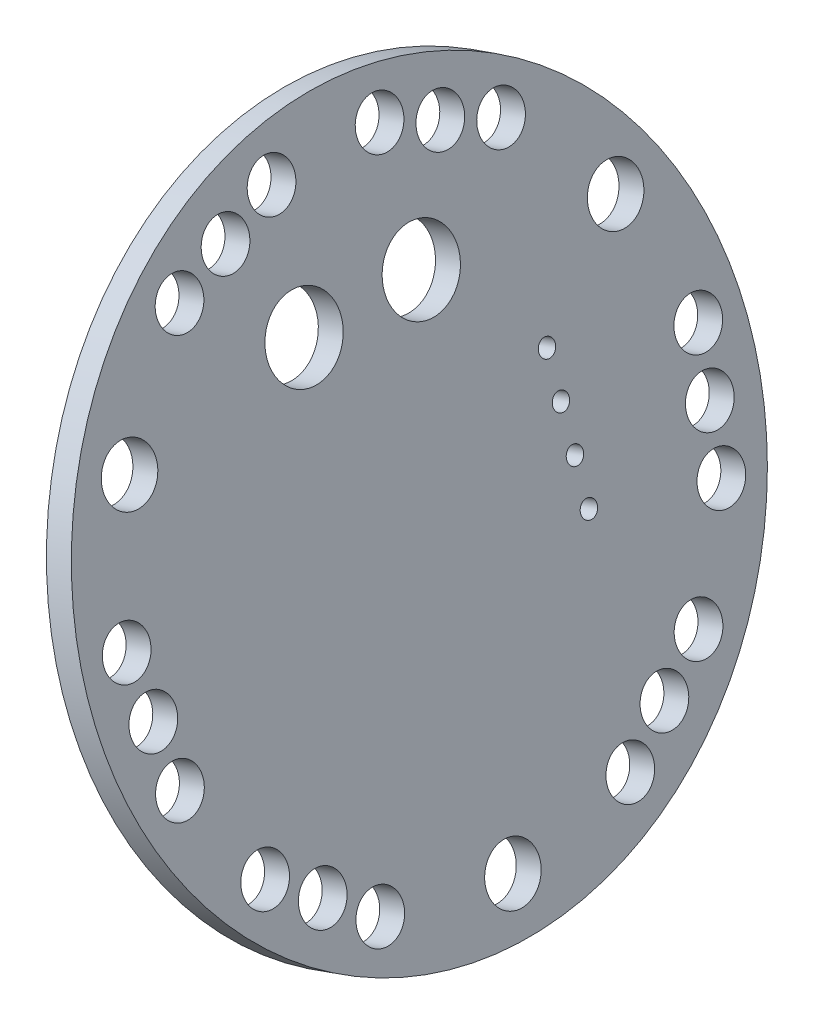
ISO-10303-21;
HEADER;
FILE_DESCRIPTION(('STEP AP214'),'2;1');
FILE_NAME('part.step','',(''),(''),'','','');
FILE_SCHEMA(('AUTOMOTIVE_DESIGN { 1 0 10303 214 1 1 1 1 }'));
ENDSEC;
DATA;
#1=APPLICATION_CONTEXT('core data for automotive mechanical design processes');
#2=APPLICATION_PROTOCOL_DEFINITION('international standard','automotive_design',2000,#1);
#3=PRODUCT_CONTEXT('',#1,'mechanical');
#4=PRODUCT('Part','Part','',(#3));
#5=PRODUCT_RELATED_PRODUCT_CATEGORY('part','',(#4));
#6=PRODUCT_DEFINITION_FORMATION('','',#4);
#7=PRODUCT_DEFINITION_CONTEXT('part definition',#1,'design');
#8=PRODUCT_DEFINITION('design','',#6,#7);
#9=PRODUCT_DEFINITION_SHAPE('','',#8);
#10=(LENGTH_UNIT() NAMED_UNIT(*) SI_UNIT(.MILLI.,.METRE.));
#11=(NAMED_UNIT(*) PLANE_ANGLE_UNIT() SI_UNIT($,.RADIAN.));
#12=(NAMED_UNIT(*) SI_UNIT($,.STERADIAN.) SOLID_ANGLE_UNIT());
#13=UNCERTAINTY_MEASURE_WITH_UNIT(LENGTH_MEASURE(1.E-05),#10,'distance_accuracy_value','');
#14=(GEOMETRIC_REPRESENTATION_CONTEXT(3) GLOBAL_UNCERTAINTY_ASSIGNED_CONTEXT((#13)) GLOBAL_UNIT_ASSIGNED_CONTEXT((#10,
#11,#12)) REPRESENTATION_CONTEXT('',''));
#15=CARTESIAN_POINT('',(0.,0.,0.));
#16=DIRECTION('',(0.,0.,1.));
#17=DIRECTION('',(1.,0.,0.));
#18=AXIS2_PLACEMENT_3D('',#15,#16,#17);
#19=CARTESIAN_POINT('',(-5.18544972870207,-1.83333333333341,0.));
#20=DIRECTION('',(-0.942809041582074,-0.333333333333304,0.));
#21=DIRECTION('',(0.333333333333304,-0.942809041582074,0.));
#22=AXIS2_PLACEMENT_3D('',#19,#20,#21);
#23=CYLINDRICAL_SURFACE('',#22,20.);
#24=CARTESIAN_POINT('',(-5.18544972870207,-1.83333333333341,0.));
#25=DIRECTION('',(0.942809041582074,0.333333333333304,0.));
#26=DIRECTION('',(-0.333333333333304,0.942809041582074,0.));
#27=AXIS2_PLACEMENT_3D('',#24,#25,#26);
#28=CIRCLE('',#27,20.);
#29=CARTESIAN_POINT('',(-11.8521163953682,17.0228474983081,0.));
#30=VERTEX_POINT('',#29);
#31=EDGE_CURVE('E10',#30,#30,#28,.T.);
#32=ORIENTED_EDGE('',*,*,#31,.F.);
#33=EDGE_LOOP('',(#32));
#34=FACE_BOUND('',#33,.T.);
#35=CARTESIAN_POINT('',(-6.69394419523339,-2.36666666666669,0.));
#36=DIRECTION('',(0.942809041582074,0.333333333333304,0.));
#37=DIRECTION('',(-0.333333333333304,0.942809041582074,0.));
#38=AXIS2_PLACEMENT_3D('',#35,#36,#37);
#39=CIRCLE('',#38,20.);
#40=CARTESIAN_POINT('',(-13.3606108618995,16.4895141649748,0.));
#41=VERTEX_POINT('',#40);
#42=EDGE_CURVE('E40',#41,#41,#39,.T.);
#43=ORIENTED_EDGE('',*,*,#42,.T.);
#44=EDGE_LOOP('',(#43));
#45=FACE_BOUND('',#44,.T.);
#46=ADVANCED_FACE('F33',(#34,#45),#23,.T.);
#47=CARTESIAN_POINT('',(-5.18544972870207,-1.83333333333341,0.));
#48=DIRECTION('',(0.942809041582074,0.333333333333304,0.));
#49=DIRECTION('',(-0.333333333333304,0.942809041582074,0.));
#50=AXIS2_PLACEMENT_3D('',#47,#48,#49);
#51=PLANE('',#50);
#52=CARTESIAN_POINT('',(-8.51878306203511,7.59475708248732,3.64999999999999));
#53=DIRECTION('',(0.942809041582074,0.333333333333304,0.));
#54=DIRECTION('',(-0.333333333333304,0.942809041582074,0.));
#55=AXIS2_PLACEMENT_3D('',#52,#53,#54);
#56=CIRCLE('',#55,2.25);
#57=CARTESIAN_POINT('',(-9.26878306203505,9.71607742604698,3.64999999999999));
#58=VERTEX_POINT('',#57);
#59=EDGE_CURVE('E132',#58,#58,#56,.T.);
#60=ORIENTED_EDGE('',*,*,#59,.F.);
#61=EDGE_LOOP('',(#60));
#62=FACE_BOUND('',#61,.T.);
#63=CARTESIAN_POINT('',(-8.5187830620351,7.59475708248732,-3.45));
#64=DIRECTION('',(0.942809041582074,0.333333333333304,0.));
#65=DIRECTION('',(-0.333333333333304,0.942809041582074,0.));
#66=AXIS2_PLACEMENT_3D('',#63,#64,#65);
#67=CIRCLE('',#66,2.25);
#68=CARTESIAN_POINT('',(-9.26878306203504,9.71607742604699,-3.45));
#69=VERTEX_POINT('',#68);
#70=EDGE_CURVE('E138',#69,#69,#67,.T.);
#71=ORIENTED_EDGE('',*,*,#70,.F.);
#72=EDGE_LOOP('',(#71));
#73=FACE_BOUND('',#72,.T.);
#74=CARTESIAN_POINT('',(-5.60878306203536,-0.635965850524169,-9.00000000000003));
#75=DIRECTION('',(0.942809041582074,0.333333333333304,0.));
#76=DIRECTION('',(-0.333333333333304,0.942809041582074,0.));
#77=AXIS2_PLACEMENT_3D('',#74,#75,#76);
#78=CIRCLE('',#77,0.500000000000001);
#79=CARTESIAN_POINT('',(-5.77544972870201,-0.164561329733131,-9.00000000000003));
#80=VERTEX_POINT('',#79);
#81=EDGE_CURVE('E147',#80,#80,#78,.T.);
#82=ORIENTED_EDGE('',*,*,#81,.F.);
#83=EDGE_LOOP('',(#82));
#84=FACE_BOUND('',#83,.T.);
#85=CARTESIAN_POINT('',(-3.91544972870217,-5.42543578176111,-9.00000000000009));
#86=DIRECTION('',(0.942809041582074,0.333333333333304,0.));
#87=DIRECTION('',(-0.333333333333304,0.942809041582074,0.));
#88=AXIS2_PLACEMENT_3D('',#85,#86,#87);
#89=CIRCLE('',#88,0.500000000000001);
#90=CARTESIAN_POINT('',(-4.08211639536883,-4.95403126097007,-9.00000000000009));
#91=VERTEX_POINT('',#90);
#92=EDGE_CURVE('E150',#91,#91,#89,.T.);
#93=ORIENTED_EDGE('',*,*,#92,.F.);
#94=EDGE_LOOP('',(#93));
#95=FACE_BOUND('',#94,.T.);
#96=CARTESIAN_POINT('',(-4.76211639536877,-3.03070081614264,-9.00000000000006));
#97=DIRECTION('',(0.942809041582074,0.333333333333304,0.));
#98=DIRECTION('',(-0.333333333333304,0.942809041582074,0.));
#99=AXIS2_PLACEMENT_3D('',#96,#97,#98);
#100=CIRCLE('',#99,0.500000000000001);
#101=CARTESIAN_POINT('',(-4.92878306203542,-2.5592962953516,-9.00000000000006));
#102=VERTEX_POINT('',#101);
#103=EDGE_CURVE('E136',#102,#102,#100,.T.);
#104=ORIENTED_EDGE('',*,*,#103,.F.);
#105=EDGE_LOOP('',(#104));
#106=FACE_BOUND('',#105,.T.);
#107=CARTESIAN_POINT('',(-6.45544972870195,1.7587691150943,-9.00000000000001));
#108=DIRECTION('',(0.942809041582074,0.333333333333304,0.));
#109=DIRECTION('',(-0.333333333333304,0.942809041582074,0.));
#110=AXIS2_PLACEMENT_3D('',#107,#108,#109);
#111=CIRCLE('',#110,0.500000000000001);
#112=CARTESIAN_POINT('',(-6.6221163953686,2.23017363588534,-9.00000000000001));
#113=VERTEX_POINT('',#112);
#114=EDGE_CURVE('E121',#113,#113,#111,.T.);
#115=ORIENTED_EDGE('',*,*,#114,.F.);
#116=EDGE_LOOP('',(#115));
#117=FACE_BOUND('',#116,.T.);
#118=CARTESIAN_POINT('',(-4.44580130612193,-3.92537499453511,16.8545626433548));
#119=DIRECTION('',(0.942809041582074,0.333333333333304,0.));
#120=DIRECTION('',(-0.166666666666648,0.47140452079103,-0.866025403784443));
#121=AXIS2_PLACEMENT_3D('',#118,#119,#120);
#122=CIRCLE('',#121,1.4);
#123=CARTESIAN_POINT('',(-4.67913463945523,-3.26540866542767,15.6421270780566));
#124=VERTEX_POINT('',#123);
#125=EDGE_CURVE('E182',#124,#124,#122,.T.);
#126=ORIENTED_EDGE('',*,*,#125,.F.);
#127=EDGE_LOOP('',(#126));
#128=FACE_BOUND('',#127,.T.);
#129=CARTESIAN_POINT('',(-5.60248697772461,-0.653773866168512,17.3114043161249));
#130=DIRECTION('',(0.942809041582074,0.333333333333304,0.));
#131=DIRECTION('',(-0.166666666666648,0.47140452079103,-0.866025403784443));
#132=AXIS2_PLACEMENT_3D('',#129,#130,#131);
#133=CIRCLE('',#132,1.4);
#134=CARTESIAN_POINT('',(-5.83582031105791,0.00619246293893092,16.0989687508267));
#135=VERTEX_POINT('',#134);
#136=EDGE_CURVE('E159',#135,#135,#133,.T.);
#137=ORIENTED_EDGE('',*,*,#136,.F.);
#138=EDGE_LOOP('',(#137));
#139=FACE_BOUND('',#138,.T.);
#140=CARTESIAN_POINT('',(-3.28911563451925,-7.19697612290172,16.3977209705846));
#141=DIRECTION('',(0.942809041582074,0.333333333333304,0.));
#142=DIRECTION('',(-0.166666666666648,0.47140452079103,-0.866025403784443));
#143=AXIS2_PLACEMENT_3D('',#140,#141,#142);
#144=CIRCLE('',#143,1.4);
#145=CARTESIAN_POINT('',(-3.52244896785255,-6.53700979379428,15.1852854052864));
#146=VERTEX_POINT('',#145);
#147=EDGE_CURVE('E129',#146,#146,#144,.T.);
#148=ORIENTED_EDGE('',*,*,#147,.F.);
#149=EDGE_LOOP('',(#148));
#150=FACE_BOUND('',#149,.T.);
#151=CARTESIAN_POINT('',(-4.4458013061218,-3.92537499453532,-16.8545626433548));
#152=DIRECTION('',(0.942809041582074,0.333333333333304,0.));
#153=DIRECTION('',(0.166666666666655,-0.47140452079104,-0.866025403784436));
#154=AXIS2_PLACEMENT_3D('',#151,#152,#153);
#155=CIRCLE('',#154,1.4);
#156=CARTESIAN_POINT('',(-4.21246797278848,-4.58534132364277,-18.066998208653));
#157=VERTEX_POINT('',#156);
#158=EDGE_CURVE('E169',#157,#157,#155,.T.);
#159=ORIENTED_EDGE('',*,*,#158,.F.);
#160=EDGE_LOOP('',(#159));
#161=FACE_BOUND('',#160,.T.);
#162=CARTESIAN_POINT('',(-3.28911563451912,-7.19697612290191,-16.3977209705846));
#163=DIRECTION('',(0.942809041582074,0.333333333333304,0.));
#164=DIRECTION('',(0.166666666666655,-0.47140452079104,-0.866025403784436));
#165=AXIS2_PLACEMENT_3D('',#162,#163,#164);
#166=CIRCLE('',#165,1.4);
#167=CARTESIAN_POINT('',(-3.05578230118581,-7.85694245200937,-17.6101565358828));
#168=VERTEX_POINT('',#167);
#169=EDGE_CURVE('E172',#168,#168,#166,.T.);
#170=ORIENTED_EDGE('',*,*,#169,.F.);
#171=EDGE_LOOP('',(#170));
#172=FACE_BOUND('',#171,.T.);
#173=CARTESIAN_POINT('',(-0.689780800385431,-14.549005274064,-10.3489442931482));
#174=DIRECTION('',(0.942809041582074,0.333333333333304,0.));
#175=DIRECTION('',(-0.166666666666655,0.47140452079104,0.866025403784436));
#176=AXIS2_PLACEMENT_3D('',#173,#174,#175);
#177=CIRCLE('',#176,1.4);
#178=CARTESIAN_POINT('',(-0.923114133718747,-13.8890389449566,-9.13650872784998));
#179=VERTEX_POINT('',#178);
#180=EDGE_CURVE('E166',#179,#179,#177,.T.);
#181=ORIENTED_EDGE('',*,*,#180,.F.);
#182=EDGE_LOOP('',(#181));
#183=FACE_BOUND('',#182,.T.);
#184=CARTESIAN_POINT('',(0.0204408667913367,-16.5578155020895,-7.57220760212885));
#185=DIRECTION('',(0.942809041582074,0.333333333333304,0.));
#186=DIRECTION('',(-0.166666666666655,0.47140452079104,0.866025403784436));
#187=AXIS2_PLACEMENT_3D('',#184,#185,#186);
#188=CIRCLE('',#187,1.4);
#189=CARTESIAN_POINT('',(-0.21289246654198,-15.897849172982,-6.35977203683064));
#190=VERTEX_POINT('',#189);
#191=EDGE_CURVE('E173',#190,#190,#188,.T.);
#192=ORIENTED_EDGE('',*,*,#191,.F.);
#193=EDGE_LOOP('',(#192));
#194=FACE_BOUND('',#193,.T.);
#195=CARTESIAN_POINT('',(-1.4000024675623,-12.5401950460384,13.1256809841677));
#196=DIRECTION('',(0.942809041582074,0.333333333333304,0.));
#197=DIRECTION('',(0.166666666666648,-0.47140452079103,0.866025403784443));
#198=AXIS2_PLACEMENT_3D('',#195,#196,#197);
#199=CIRCLE('',#198,1.4);
#200=CARTESIAN_POINT('',(-1.166669134229,-13.2001613751459,14.3381165494659));
#201=VERTEX_POINT('',#200);
#202=EDGE_CURVE('E158',#201,#201,#199,.T.);
#203=ORIENTED_EDGE('',*,*,#202,.F.);
#204=EDGE_LOOP('',(#203));
#205=FACE_BOUND('',#204,.T.);
#206=CARTESIAN_POINT('',(-0.689780800385511,-14.5490052740639,10.3489442931484));
#207=DIRECTION('',(0.942809041582074,0.333333333333304,0.));
#208=DIRECTION('',(0.166666666666648,-0.47140452079103,0.866025403784443));
#209=AXIS2_PLACEMENT_3D('',#206,#207,#208);
#210=CIRCLE('',#209,1.4);
#211=CARTESIAN_POINT('',(-0.456447467052204,-15.2089716031713,11.5613798584466));
#212=VERTEX_POINT('',#211);
#213=EDGE_CURVE('E155',#212,#212,#210,.T.);
#214=ORIENTED_EDGE('',*,*,#213,.F.);
#215=EDGE_LOOP('',(#214));
#216=FACE_BOUND('',#215,.T.);
#217=CARTESIAN_POINT('',(0.0204408667912807,-16.5578155020894,7.57220760212905));
#218=DIRECTION('',(0.942809041582074,0.333333333333304,0.));
#219=DIRECTION('',(0.166666666666648,-0.47140452079103,0.866025403784443));
#220=AXIS2_PLACEMENT_3D('',#217,#218,#219);
#221=CIRCLE('',#220,1.4);
#222=CARTESIAN_POINT('',(0.253774200124588,-17.2177818311968,8.78464316742728));
#223=VERTEX_POINT('',#222);
#224=EDGE_CURVE('E162',#223,#223,#221,.T.);
#225=ORIENTED_EDGE('',*,*,#224,.F.);
#226=EDGE_LOOP('',(#225));
#227=FACE_BOUND('',#226,.T.);
#228=CARTESIAN_POINT('',(-1.4000024675622,-12.5401950460386,-13.1256809841675));
#229=DIRECTION('',(0.942809041582074,0.333333333333304,0.));
#230=DIRECTION('',(-0.166666666666655,0.47140452079104,0.866025403784436));
#231=AXIS2_PLACEMENT_3D('',#228,#229,#230);
#232=CIRCLE('',#231,1.4);
#233=CARTESIAN_POINT('',(-1.63333580089552,-11.8802287169311,-11.9132454188693));
#234=VERTEX_POINT('',#233);
#235=EDGE_CURVE('E163',#234,#234,#232,.T.);
#236=ORIENTED_EDGE('',*,*,#235,.F.);
#237=EDGE_LOOP('',(#236));
#238=FACE_BOUND('',#237,.T.);
#239=CARTESIAN_POINT('',(-5.60248697772447,-0.653773866168718,-17.311404316125));
#240=DIRECTION('',(0.942809041582074,0.333333333333304,0.));
#241=DIRECTION('',(0.166666666666655,-0.47140452079104,-0.866025403784436));
#242=AXIS2_PLACEMENT_3D('',#239,#240,#241);
#243=CIRCLE('',#242,1.4);
#244=CARTESIAN_POINT('',(-5.36915364439116,-1.31374019527618,-18.5238398814232));
#245=VERTEX_POINT('',#244);
#246=EDGE_CURVE('E83',#245,#245,#243,.T.);
#247=ORIENTED_EDGE('',*,*,#246,.F.);
#248=EDGE_LOOP('',(#247));
#249=FACE_BOUND('',#248,.T.);
#250=CARTESIAN_POINT('',(-9.97430307517302,11.7115893682579,9.73919671399603));
#251=DIRECTION('',(0.942809041582074,0.333333333333304,0.));
#252=DIRECTION('',(-0.333333333333304,0.942809041582074,0.));
#253=AXIS2_PLACEMENT_3D('',#250,#251,#252);
#254=CIRCLE('',#253,1.4);
#255=CARTESIAN_POINT('',(-10.4409697418396,13.0315220264728,9.73919671399603));
#256=VERTEX_POINT('',#255);
#257=EDGE_CURVE('E64',#256,#256,#254,.T.);
#258=ORIENTED_EDGE('',*,*,#257,.F.);
#259=EDGE_LOOP('',(#258));
#260=FACE_BOUND('',#259,.T.);
#261=CARTESIAN_POINT('',(-10.8672310840248,14.2371711689402,-3.27203998641704));
#262=DIRECTION('',(0.942809041582074,0.333333333333304,0.));
#263=DIRECTION('',(0.333333333333304,-0.942809041582074,0.));
#264=AXIS2_PLACEMENT_3D('',#261,#262,#263);
#265=CIRCLE('',#264,1.4);
#266=CARTESIAN_POINT('',(-10.4005644173582,12.9172385107253,-3.27203998641704));
#267=VERTEX_POINT('',#266);
#268=EDGE_CURVE('E116',#267,#267,#265,.T.);
#269=ORIENTED_EDGE('',*,*,#268,.F.);
#270=EDGE_LOOP('',(#269));
#271=FACE_BOUND('',#270,.T.);
#272=CARTESIAN_POINT('',(-10.4207670795989,12.974380268599,-6.50561835020655));
#273=DIRECTION('',(0.942809041582074,0.333333333333304,0.));
#274=DIRECTION('',(0.333333333333304,-0.942809041582074,0.));
#275=AXIS2_PLACEMENT_3D('',#272,#273,#274);
#276=CIRCLE('',#275,1.4);
#277=CARTESIAN_POINT('',(-9.95410041293227,11.6544476103841,-6.50561835020655));
#278=VERTEX_POINT('',#277);
#279=EDGE_CURVE('E194',#278,#278,#276,.T.);
#280=ORIENTED_EDGE('',*,*,#279,.F.);
#281=EDGE_LOOP('',(#280));
#282=FACE_BOUND('',#281,.T.);
#283=CARTESIAN_POINT('',(-9.97430307517299,11.7115893682579,-9.73919671399605));
#284=DIRECTION('',(0.942809041582074,0.333333333333304,0.));
#285=DIRECTION('',(0.333333333333304,-0.942809041582074,0.));
#286=AXIS2_PLACEMENT_3D('',#283,#284,#285);
#287=CIRCLE('',#286,1.4);
#288=CARTESIAN_POINT('',(-9.50763640850636,10.391656710043,-9.73919671399605));
#289=VERTEX_POINT('',#288);
#290=EDGE_CURVE('E200',#289,#289,#287,.T.);
#291=ORIENTED_EDGE('',*,*,#290,.F.);
#292=EDGE_LOOP('',(#291));
#293=FACE_BOUND('',#292,.T.);
#294=CARTESIAN_POINT('',(-10.4207670795989,12.974380268599,6.50561835020653));
#295=DIRECTION('',(0.942809041582074,0.333333333333304,0.));
#296=DIRECTION('',(-0.333333333333304,0.942809041582074,0.));
#297=AXIS2_PLACEMENT_3D('',#294,#295,#296);
#298=CIRCLE('',#297,1.4);
#299=CARTESIAN_POINT('',(-10.8874337462655,14.2943129268139,6.50561835020653));
#300=VERTEX_POINT('',#299);
#301=EDGE_CURVE('E197',#300,#300,#298,.T.);
#302=ORIENTED_EDGE('',*,*,#301,.F.);
#303=EDGE_LOOP('',(#302));
#304=FACE_BOUND('',#303,.T.);
#305=CARTESIAN_POINT('',(-10.8672310840248,14.2371711689402,3.27203998641703));
#306=DIRECTION('',(0.942809041582074,0.333333333333304,0.));
#307=DIRECTION('',(-0.333333333333304,0.942809041582074,0.));
#308=AXIS2_PLACEMENT_3D('',#305,#306,#307);
#309=CIRCLE('',#308,1.4);
#310=CARTESIAN_POINT('',(-11.3338977506914,15.5571038271551,3.27203998641703));
#311=VERTEX_POINT('',#310);
#312=EDGE_CURVE('E191',#311,#311,#309,.T.);
#313=ORIENTED_EDGE('',*,*,#312,.F.);
#314=EDGE_LOOP('',(#313));
#315=FACE_BOUND('',#314,.T.);
#316=CARTESIAN_POINT('',(0.481216937964106,-17.8610870402287,0.));
#317=DIRECTION('',(0.942809041582074,0.333333333333304,0.));
#318=DIRECTION('',(-0.333333333333304,0.942809041582074,0.));
#319=AXIS2_PLACEMENT_3D('',#316,#317,#318);
#320=CIRCLE('',#319,1.625);
#321=CARTESIAN_POINT('',(-0.0604497287025137,-16.3290223476578,0.));
#322=VERTEX_POINT('',#321);
#323=EDGE_CURVE('E55',#322,#322,#320,.T.);
#324=ORIENTED_EDGE('',*,*,#323,.F.);
#325=EDGE_LOOP('',(#324));
#326=FACE_BOUND('',#325,.T.);
#327=CARTESIAN_POINT('',(-8.01878306203518,6.18054352011421,14.7224318643355));
#328=DIRECTION('',(0.942809041582074,0.333333333333304,0.));
#329=DIRECTION('',(-0.333333333333304,0.942809041582074,0.));
#330=AXIS2_PLACEMENT_3D('',#327,#328,#329);
#331=CIRCLE('',#330,1.625);
#332=CARTESIAN_POINT('',(-8.56044972870179,7.71260821268508,14.7224318643355));
#333=VERTEX_POINT('',#332);
#334=EDGE_CURVE('E206',#333,#333,#331,.T.);
#335=ORIENTED_EDGE('',*,*,#334,.F.);
#336=EDGE_LOOP('',(#335));
#337=FACE_BOUND('',#336,.T.);
#338=CARTESIAN_POINT('',(-8.01878306203513,6.18054352011423,-14.7224318643355));
#339=DIRECTION('',(0.942809041582074,0.333333333333304,0.));
#340=DIRECTION('',(-0.333333333333304,0.942809041582074,0.));
#341=AXIS2_PLACEMENT_3D('',#338,#339,#340);
#342=CIRCLE('',#341,1.625);
#343=CARTESIAN_POINT('',(-8.56044972870175,7.71260821268511,-14.7224318643355));
#344=VERTEX_POINT('',#343);
#345=EDGE_CURVE('E48',#344,#344,#342,.T.);
#346=ORIENTED_EDGE('',*,*,#345,.F.);
#347=EDGE_LOOP('',(#346));
#348=FACE_BOUND('',#347,.T.);
#349=ORIENTED_EDGE('',*,*,#31,.T.);
#350=EDGE_LOOP('',(#349));
#351=FACE_BOUND('',#350,.T.);
#352=ADVANCED_FACE('F216',(#62,#73,#84,#95,#106,#117,#128,#139,#150,#161,#172,#183,#194,#205,
#216,#227,#238,#249,#260,#271,#282,#293,#304,#315,#326,#337,#348,#351),#51,.T.);
#353=CARTESIAN_POINT('',(-6.69394419523339,-2.36666666666669,0.));
#354=DIRECTION('',(0.942809041582074,0.333333333333304,0.));
#355=DIRECTION('',(-0.333333333333304,0.942809041582074,0.));
#356=AXIS2_PLACEMENT_3D('',#353,#354,#355);
#357=PLANE('',#356);
#358=CARTESIAN_POINT('',(-10.0272775285664,7.06142374915403,3.64999999999999));
#359=DIRECTION('',(0.942809041582074,0.333333333333304,0.));
#360=DIRECTION('',(-0.333333333333304,0.942809041582074,0.));
#361=AXIS2_PLACEMENT_3D('',#358,#359,#360);
#362=CIRCLE('',#361,2.25);
#363=CARTESIAN_POINT('',(-10.7772775285664,9.1827440927137,3.64999999999999));
#364=VERTEX_POINT('',#363);
#365=EDGE_CURVE('E36',#364,#364,#362,.T.);
#366=ORIENTED_EDGE('',*,*,#365,.T.);
#367=EDGE_LOOP('',(#366));
#368=FACE_BOUND('',#367,.T.);
#369=CARTESIAN_POINT('',(-10.0272775285664,7.06142374915404,-3.45));
#370=DIRECTION('',(0.942809041582074,0.333333333333304,0.));
#371=DIRECTION('',(-0.333333333333304,0.942809041582074,0.));
#372=AXIS2_PLACEMENT_3D('',#369,#370,#371);
#373=CIRCLE('',#372,2.25);
#374=CARTESIAN_POINT('',(-10.7772775285664,9.1827440927137,-3.45));
#375=VERTEX_POINT('',#374);
#376=EDGE_CURVE('E130',#375,#375,#373,.T.);
#377=ORIENTED_EDGE('',*,*,#376,.T.);
#378=EDGE_LOOP('',(#377));
#379=FACE_BOUND('',#378,.T.);
#380=CARTESIAN_POINT('',(-7.11727752856667,-1.16929918385745,-9.00000000000004));
#381=DIRECTION('',(0.942809041582074,0.333333333333304,0.));
#382=DIRECTION('',(-0.333333333333304,0.942809041582074,0.));
#383=AXIS2_PLACEMENT_3D('',#380,#381,#382);
#384=CIRCLE('',#383,0.500000000000001);
#385=CARTESIAN_POINT('',(-7.28394419523332,-0.697894663066415,-9.00000000000004));
#386=VERTEX_POINT('',#385);
#387=EDGE_CURVE('E127',#386,#386,#384,.T.);
#388=ORIENTED_EDGE('',*,*,#387,.T.);
#389=EDGE_LOOP('',(#388));
#390=FACE_BOUND('',#389,.T.);
#391=CARTESIAN_POINT('',(-5.42394419523348,-5.95876911509439,-9.00000000000009));
#392=DIRECTION('',(0.942809041582074,0.333333333333304,0.));
#393=DIRECTION('',(-0.333333333333304,0.942809041582074,0.));
#394=AXIS2_PLACEMENT_3D('',#391,#392,#393);
#395=CIRCLE('',#394,0.500000000000001);
#396=CARTESIAN_POINT('',(-5.59061086190013,-5.48736459430335,-9.00000000000009));
#397=VERTEX_POINT('',#396);
#398=EDGE_CURVE('E124',#397,#397,#395,.T.);
#399=ORIENTED_EDGE('',*,*,#398,.T.);
#400=EDGE_LOOP('',(#399));
#401=FACE_BOUND('',#400,.T.);
#402=CARTESIAN_POINT('',(-6.27061086190007,-3.56403414947592,-9.00000000000006));
#403=DIRECTION('',(0.942809041582074,0.333333333333304,0.));
#404=DIRECTION('',(-0.333333333333304,0.942809041582074,0.));
#405=AXIS2_PLACEMENT_3D('',#402,#403,#404);
#406=CIRCLE('',#405,0.500000000000001);
#407=CARTESIAN_POINT('',(-6.43727752856673,-3.09262962868488,-9.00000000000006));
#408=VERTEX_POINT('',#407);
#409=EDGE_CURVE('E120',#408,#408,#406,.T.);
#410=ORIENTED_EDGE('',*,*,#409,.T.);
#411=EDGE_LOOP('',(#410));
#412=FACE_BOUND('',#411,.T.);
#413=CARTESIAN_POINT('',(-7.96394419523326,1.22543578176101,-9.00000000000001));
#414=DIRECTION('',(0.942809041582074,0.333333333333304,0.));
#415=DIRECTION('',(-0.333333333333304,0.942809041582074,0.));
#416=AXIS2_PLACEMENT_3D('',#413,#414,#415);
#417=CIRCLE('',#416,0.500000000000001);
#418=CARTESIAN_POINT('',(-8.13061086189991,1.69684030255205,-9.00000000000001));
#419=VERTEX_POINT('',#418);
#420=EDGE_CURVE('E117',#419,#419,#417,.T.);
#421=ORIENTED_EDGE('',*,*,#420,.T.);
#422=EDGE_LOOP('',(#421));
#423=FACE_BOUND('',#422,.T.);
#424=CARTESIAN_POINT('',(-5.95429577265324,-4.4587083278684,16.8545626433548));
#425=DIRECTION('',(0.942809041582074,0.333333333333304,0.));
#426=DIRECTION('',(-0.333333333333304,0.942809041582074,0.));
#427=AXIS2_PLACEMENT_3D('',#424,#425,#426);
#428=CIRCLE('',#427,1.4);
#429=CARTESIAN_POINT('',(-6.42096243931987,-3.1387756696535,16.8545626433548));
#430=VERTEX_POINT('',#429);
#431=EDGE_CURVE('E113',#430,#430,#428,.T.);
#432=ORIENTED_EDGE('',*,*,#431,.T.);
#433=EDGE_LOOP('',(#432));
#434=FACE_BOUND('',#433,.T.);
#435=CARTESIAN_POINT('',(-7.11098144425592,-1.1871071995018,17.3114043161249));
#436=DIRECTION('',(0.942809041582074,0.333333333333304,0.));
#437=DIRECTION('',(-0.333333333333304,0.942809041582074,0.));
#438=AXIS2_PLACEMENT_3D('',#435,#436,#437);
#439=CIRCLE('',#438,1.4);
#440=CARTESIAN_POINT('',(-7.57764811092255,0.132825458713108,17.3114043161249));
#441=VERTEX_POINT('',#440);
#442=EDGE_CURVE('E110',#441,#441,#439,.T.);
#443=ORIENTED_EDGE('',*,*,#442,.T.);
#444=EDGE_LOOP('',(#443));
#445=FACE_BOUND('',#444,.T.);
#446=CARTESIAN_POINT('',(-4.79761010105056,-7.730309456235,16.3977209705846));
#447=DIRECTION('',(0.942809041582074,0.333333333333304,0.));
#448=DIRECTION('',(-0.333333333333304,0.942809041582074,0.));
#449=AXIS2_PLACEMENT_3D('',#446,#447,#448);
#450=CIRCLE('',#449,1.4);
#451=CARTESIAN_POINT('',(-5.26427676771718,-6.4103767980201,16.3977209705846));
#452=VERTEX_POINT('',#451);
#453=EDGE_CURVE('E107',#452,#452,#450,.T.);
#454=ORIENTED_EDGE('',*,*,#453,.T.);
#455=EDGE_LOOP('',(#454));
#456=FACE_BOUND('',#455,.T.);
#457=CARTESIAN_POINT('',(-5.95429577265311,-4.4587083278686,-16.8545626433548));
#458=DIRECTION('',(0.942809041582074,0.333333333333304,0.));
#459=DIRECTION('',(-0.333333333333304,0.942809041582074,0.));
#460=AXIS2_PLACEMENT_3D('',#457,#458,#459);
#461=CIRCLE('',#460,1.4);
#462=CARTESIAN_POINT('',(-6.42096243931974,-3.1387756696537,-16.8545626433548));
#463=VERTEX_POINT('',#462);
#464=EDGE_CURVE('E104',#463,#463,#461,.T.);
#465=ORIENTED_EDGE('',*,*,#464,.T.);
#466=EDGE_LOOP('',(#465));
#467=FACE_BOUND('',#466,.T.);
#468=CARTESIAN_POINT('',(-4.79761010105043,-7.7303094562352,-16.3977209705846));
#469=DIRECTION('',(0.942809041582074,0.333333333333304,0.));
#470=DIRECTION('',(-0.333333333333304,0.942809041582074,0.));
#471=AXIS2_PLACEMENT_3D('',#468,#469,#470);
#472=CIRCLE('',#471,1.4);
#473=CARTESIAN_POINT('',(-5.26427676771706,-6.4103767980203,-16.3977209705846));
#474=VERTEX_POINT('',#473);
#475=EDGE_CURVE('E101',#474,#474,#472,.T.);
#476=ORIENTED_EDGE('',*,*,#475,.T.);
#477=EDGE_LOOP('',(#476));
#478=FACE_BOUND('',#477,.T.);
#479=CARTESIAN_POINT('',(-2.19827526691675,-15.0823386073973,-10.3489442931482));
#480=DIRECTION('',(0.942809041582074,0.333333333333304,0.));
#481=DIRECTION('',(-0.333333333333304,0.942809041582074,0.));
#482=AXIS2_PLACEMENT_3D('',#479,#480,#481);
#483=CIRCLE('',#482,1.4);
#484=CARTESIAN_POINT('',(-2.66494193358337,-13.7624059491824,-10.3489442931482));
#485=VERTEX_POINT('',#484);
#486=EDGE_CURVE('E98',#485,#485,#483,.T.);
#487=ORIENTED_EDGE('',*,*,#486,.T.);
#488=EDGE_LOOP('',(#487));
#489=FACE_BOUND('',#488,.T.);
#490=CARTESIAN_POINT('',(-1.48805359973998,-17.0911488354228,-7.57220760212886));
#491=DIRECTION('',(0.942809041582074,0.333333333333304,0.));
#492=DIRECTION('',(-0.333333333333304,0.942809041582074,0.));
#493=AXIS2_PLACEMENT_3D('',#490,#491,#492);
#494=CIRCLE('',#493,1.4);
#495=CARTESIAN_POINT('',(-1.95472026640661,-15.7712161772079,-7.57220760212886));
#496=VERTEX_POINT('',#495);
#497=EDGE_CURVE('E95',#496,#496,#494,.T.);
#498=ORIENTED_EDGE('',*,*,#497,.T.);
#499=EDGE_LOOP('',(#498));
#500=FACE_BOUND('',#499,.T.);
#501=CARTESIAN_POINT('',(-2.90849693409362,-13.0735283793717,13.1256809841677));
#502=DIRECTION('',(0.942809041582074,0.333333333333304,0.));
#503=DIRECTION('',(-0.333333333333304,0.942809041582074,0.));
#504=AXIS2_PLACEMENT_3D('',#501,#502,#503);
#505=CIRCLE('',#504,1.4);
#506=CARTESIAN_POINT('',(-3.37516360076024,-11.7535957211568,13.1256809841677));
#507=VERTEX_POINT('',#506);
#508=EDGE_CURVE('E92',#507,#507,#505,.T.);
#509=ORIENTED_EDGE('',*,*,#508,.T.);
#510=EDGE_LOOP('',(#509));
#511=FACE_BOUND('',#510,.T.);
#512=CARTESIAN_POINT('',(-2.19827526691682,-15.0823386073972,10.3489442931484));
#513=DIRECTION('',(0.942809041582074,0.333333333333304,0.));
#514=DIRECTION('',(-0.333333333333304,0.942809041582074,0.));
#515=AXIS2_PLACEMENT_3D('',#512,#513,#514);
#516=CIRCLE('',#515,1.4);
#517=CARTESIAN_POINT('',(-2.66494193358345,-13.7624059491823,10.3489442931484));
#518=VERTEX_POINT('',#517);
#519=EDGE_CURVE('E89',#518,#518,#516,.T.);
#520=ORIENTED_EDGE('',*,*,#519,.T.);
#521=EDGE_LOOP('',(#520));
#522=FACE_BOUND('',#521,.T.);
#523=CARTESIAN_POINT('',(-1.48805359974003,-17.0911488354227,7.57220760212905));
#524=DIRECTION('',(0.942809041582074,0.333333333333304,0.));
#525=DIRECTION('',(-0.333333333333304,0.942809041582074,0.));
#526=AXIS2_PLACEMENT_3D('',#523,#524,#525);
#527=CIRCLE('',#526,1.4);
#528=CARTESIAN_POINT('',(-1.95472026640666,-15.7712161772078,7.57220760212905));
#529=VERTEX_POINT('',#528);
#530=EDGE_CURVE('E86',#529,#529,#527,.T.);
#531=ORIENTED_EDGE('',*,*,#530,.T.);
#532=EDGE_LOOP('',(#531));
#533=FACE_BOUND('',#532,.T.);
#534=CARTESIAN_POINT('',(-2.90849693409352,-13.0735283793719,-13.1256809841675));
#535=DIRECTION('',(0.942809041582074,0.333333333333304,0.));
#536=DIRECTION('',(-0.333333333333304,0.942809041582074,0.));
#537=AXIS2_PLACEMENT_3D('',#534,#535,#536);
#538=CIRCLE('',#537,1.4);
#539=CARTESIAN_POINT('',(-3.37516360076014,-11.753595721157,-13.1256809841675));
#540=VERTEX_POINT('',#539);
#541=EDGE_CURVE('E82',#540,#540,#538,.T.);
#542=ORIENTED_EDGE('',*,*,#541,.T.);
#543=EDGE_LOOP('',(#542));
#544=FACE_BOUND('',#543,.T.);
#545=CARTESIAN_POINT('',(-7.11098144425579,-1.187107199502,-17.311404316125));
#546=DIRECTION('',(0.942809041582074,0.333333333333304,0.));
#547=DIRECTION('',(-0.333333333333304,0.942809041582074,0.));
#548=AXIS2_PLACEMENT_3D('',#545,#546,#547);
#549=CIRCLE('',#548,1.4);
#550=CARTESIAN_POINT('',(-7.57764811092241,0.1328254587129,-17.311404316125));
#551=VERTEX_POINT('',#550);
#552=EDGE_CURVE('E79',#551,#551,#549,.T.);
#553=ORIENTED_EDGE('',*,*,#552,.T.);
#554=EDGE_LOOP('',(#553));
#555=FACE_BOUND('',#554,.T.);
#556=CARTESIAN_POINT('',(-11.4827975417043,11.1782560349246,9.73919671399603));
#557=DIRECTION('',(0.942809041582074,0.333333333333304,0.));
#558=DIRECTION('',(-0.333333333333304,0.942809041582074,0.));
#559=AXIS2_PLACEMENT_3D('',#556,#557,#558);
#560=CIRCLE('',#559,1.4);
#561=CARTESIAN_POINT('',(-11.949464208371,12.4981886931395,9.73919671399603));
#562=VERTEX_POINT('',#561);
#563=EDGE_CURVE('E76',#562,#562,#560,.T.);
#564=ORIENTED_EDGE('',*,*,#563,.T.);
#565=EDGE_LOOP('',(#564));
#566=FACE_BOUND('',#565,.T.);
#567=CARTESIAN_POINT('',(-12.3757255505561,13.7038378356069,-3.27203998641705));
#568=DIRECTION('',(0.942809041582074,0.333333333333304,0.));
#569=DIRECTION('',(-0.333333333333304,0.942809041582074,0.));
#570=AXIS2_PLACEMENT_3D('',#567,#568,#569);
#571=CIRCLE('',#570,1.4);
#572=CARTESIAN_POINT('',(-12.8423922172227,15.0237704938218,-3.27203998641705));
#573=VERTEX_POINT('',#572);
#574=EDGE_CURVE('E73',#573,#573,#571,.T.);
#575=ORIENTED_EDGE('',*,*,#574,.T.);
#576=EDGE_LOOP('',(#575));
#577=FACE_BOUND('',#576,.T.);
#578=CARTESIAN_POINT('',(-11.9292615461302,12.4410469352657,-6.50561835020655));
#579=DIRECTION('',(0.942809041582074,0.333333333333304,0.));
#580=DIRECTION('',(-0.333333333333304,0.942809041582074,0.));
#581=AXIS2_PLACEMENT_3D('',#578,#579,#580);
#582=CIRCLE('',#581,1.4);
#583=CARTESIAN_POINT('',(-12.3959282127968,13.7609795934806,-6.50561835020655));
#584=VERTEX_POINT('',#583);
#585=EDGE_CURVE('E70',#584,#584,#582,.T.);
#586=ORIENTED_EDGE('',*,*,#585,.T.);
#587=EDGE_LOOP('',(#586));
#588=FACE_BOUND('',#587,.T.);
#589=CARTESIAN_POINT('',(-11.4827975417043,11.1782560349246,-9.73919671399605));
#590=DIRECTION('',(0.942809041582074,0.333333333333304,0.));
#591=DIRECTION('',(-0.333333333333304,0.942809041582074,0.));
#592=AXIS2_PLACEMENT_3D('',#589,#590,#591);
#593=CIRCLE('',#592,1.4);
#594=CARTESIAN_POINT('',(-11.9494642083709,12.4981886931395,-9.73919671399605));
#595=VERTEX_POINT('',#594);
#596=EDGE_CURVE('E67',#595,#595,#593,.T.);
#597=ORIENTED_EDGE('',*,*,#596,.T.);
#598=EDGE_LOOP('',(#597));
#599=FACE_BOUND('',#598,.T.);
#600=CARTESIAN_POINT('',(-11.9292615461302,12.4410469352657,6.50561835020653));
#601=DIRECTION('',(0.942809041582074,0.333333333333304,0.));
#602=DIRECTION('',(-0.333333333333304,0.942809041582074,0.));
#603=AXIS2_PLACEMENT_3D('',#600,#601,#602);
#604=CIRCLE('',#603,1.4);
#605=CARTESIAN_POINT('',(-12.3959282127969,13.7609795934806,6.50561835020653));
#606=VERTEX_POINT('',#605);
#607=EDGE_CURVE('E63',#606,#606,#604,.T.);
#608=ORIENTED_EDGE('',*,*,#607,.T.);
#609=EDGE_LOOP('',(#608));
#610=FACE_BOUND('',#609,.T.);
#611=CARTESIAN_POINT('',(-12.3757255505561,13.7038378356069,3.27203998641702));
#612=DIRECTION('',(0.942809041582074,0.333333333333304,0.));
#613=DIRECTION('',(-0.333333333333304,0.942809041582074,0.));
#614=AXIS2_PLACEMENT_3D('',#611,#612,#613);
#615=CIRCLE('',#614,1.4);
#616=CARTESIAN_POINT('',(-12.8423922172227,15.0237704938218,3.27203998641702));
#617=VERTEX_POINT('',#616);
#618=EDGE_CURVE('E60',#617,#617,#615,.T.);
#619=ORIENTED_EDGE('',*,*,#618,.T.);
#620=EDGE_LOOP('',(#619));
#621=FACE_BOUND('',#620,.T.);
#622=CARTESIAN_POINT('',(-1.02727752856722,-18.3944203735619,0.));
#623=DIRECTION('',(0.942809041582074,0.333333333333304,0.));
#624=DIRECTION('',(-0.333333333333304,0.942809041582074,0.));
#625=AXIS2_PLACEMENT_3D('',#622,#623,#624);
#626=CIRCLE('',#625,1.625);
#627=CARTESIAN_POINT('',(-1.56894419523384,-16.8623556809911,0.));
#628=VERTEX_POINT('',#627);
#629=EDGE_CURVE('E45',#628,#628,#626,.T.);
#630=ORIENTED_EDGE('',*,*,#629,.T.);
#631=EDGE_LOOP('',(#630));
#632=FACE_BOUND('',#631,.T.);
#633=CARTESIAN_POINT('',(-9.52727752856649,5.64721018678092,14.7224318643354));
#634=DIRECTION('',(0.942809041582074,0.333333333333304,0.));
#635=DIRECTION('',(-0.333333333333304,0.942809041582074,0.));
#636=AXIS2_PLACEMENT_3D('',#633,#634,#635);
#637=CIRCLE('',#636,1.625);
#638=CARTESIAN_POINT('',(-10.0689441952331,7.17927487935179,14.7224318643354));
#639=VERTEX_POINT('',#638);
#640=EDGE_CURVE('E54',#639,#639,#637,.T.);
#641=ORIENTED_EDGE('',*,*,#640,.T.);
#642=EDGE_LOOP('',(#641));
#643=FACE_BOUND('',#642,.T.);
#644=CARTESIAN_POINT('',(-9.52727752856645,5.64721018678095,-14.7224318643355));
#645=DIRECTION('',(0.942809041582074,0.333333333333304,0.));
#646=DIRECTION('',(-0.333333333333304,0.942809041582074,0.));
#647=AXIS2_PLACEMENT_3D('',#644,#645,#646);
#648=CIRCLE('',#647,1.625);
#649=CARTESIAN_POINT('',(-10.0689441952331,7.17927487935182,-14.7224318643355));
#650=VERTEX_POINT('',#649);
#651=EDGE_CURVE('E51',#650,#650,#648,.T.);
#652=ORIENTED_EDGE('',*,*,#651,.T.);
#653=EDGE_LOOP('',(#652));
#654=FACE_BOUND('',#653,.T.);
#655=ORIENTED_EDGE('',*,*,#42,.F.);
#656=EDGE_LOOP('',(#655));
#657=FACE_BOUND('',#656,.T.);
#658=ADVANCED_FACE('F218',(#368,#379,#390,#401,#412,#423,#434,#445,#456,#467,#478,#489,#500,
#511,#522,#533,#544,#555,#566,#577,#588,#599,#610,#621,#632,#643,#654,#657),#357,.F.);
#659=CARTESIAN_POINT('',(-21.3791293804176,1.45694777975023,-14.7224318643355));
#660=DIRECTION('',(0.942809041582074,0.333333333333304,0.));
#661=DIRECTION('',(-0.333333333333304,0.942809041582074,0.));
#662=AXIS2_PLACEMENT_3D('',#659,#660,#661);
#663=CYLINDRICAL_SURFACE('',#662,1.625);
#664=ORIENTED_EDGE('',*,*,#345,.T.);
#665=EDGE_LOOP('',(#664));
#666=FACE_BOUND('',#665,.T.);
#667=ORIENTED_EDGE('',*,*,#651,.F.);
#668=EDGE_LOOP('',(#667));
#669=FACE_BOUND('',#668,.T.);
#670=ADVANCED_FACE('F213',(#666,#669),#663,.F.);
#671=CARTESIAN_POINT('',(-21.3791293804176,1.4569477797502,14.7224318643354));
#672=DIRECTION('',(0.942809041582074,0.333333333333304,0.));
#673=DIRECTION('',(-0.333333333333304,0.942809041582074,0.));
#674=AXIS2_PLACEMENT_3D('',#671,#672,#673);
#675=CYLINDRICAL_SURFACE('',#674,1.625);
#676=ORIENTED_EDGE('',*,*,#334,.T.);
#677=EDGE_LOOP('',(#676));
#678=FACE_BOUND('',#677,.T.);
#679=ORIENTED_EDGE('',*,*,#640,.F.);
#680=EDGE_LOOP('',(#679));
#681=FACE_BOUND('',#680,.T.);
#682=ADVANCED_FACE('F231',(#678,#681),#675,.F.);
#683=CARTESIAN_POINT('',(-12.8791293804183,-22.5846827805927,0.));
#684=DIRECTION('',(0.942809041582074,0.333333333333304,0.));
#685=DIRECTION('',(-0.333333333333304,0.942809041582074,0.));
#686=AXIS2_PLACEMENT_3D('',#683,#684,#685);
#687=CYLINDRICAL_SURFACE('',#686,1.625);
#688=ORIENTED_EDGE('',*,*,#323,.T.);
#689=EDGE_LOOP('',(#688));
#690=FACE_BOUND('',#689,.T.);
#691=ORIENTED_EDGE('',*,*,#629,.F.);
#692=EDGE_LOOP('',(#691));
#693=FACE_BOUND('',#692,.T.);
#694=ADVANCED_FACE('F234',(#690,#693),#687,.F.);
#695=CARTESIAN_POINT('',(-24.2275774024072,9.51357542857615,3.272039986417));
#696=DIRECTION('',(0.942809041582074,0.333333333333304,0.));
#697=DIRECTION('',(-0.333333333333304,0.942809041582074,0.));
#698=AXIS2_PLACEMENT_3D('',#695,#696,#697);
#699=CYLINDRICAL_SURFACE('',#698,1.4);
#700=ORIENTED_EDGE('',*,*,#312,.T.);
#701=EDGE_LOOP('',(#700));
#702=FACE_BOUND('',#701,.T.);
#703=ORIENTED_EDGE('',*,*,#618,.F.);
#704=EDGE_LOOP('',(#703));
#705=FACE_BOUND('',#704,.T.);
#706=ADVANCED_FACE('F237',(#702,#705),#699,.F.);
#707=CARTESIAN_POINT('',(-23.7811133979813,8.25078452823501,6.50561835020651));
#708=DIRECTION('',(0.942809041582074,0.333333333333304,0.));
#709=DIRECTION('',(-0.333333333333304,0.942809041582074,0.));
#710=AXIS2_PLACEMENT_3D('',#707,#708,#709);
#711=CYLINDRICAL_SURFACE('',#710,1.4);
#712=ORIENTED_EDGE('',*,*,#301,.T.);
#713=EDGE_LOOP('',(#712));
#714=FACE_BOUND('',#713,.T.);
#715=ORIENTED_EDGE('',*,*,#607,.F.);
#716=EDGE_LOOP('',(#715));
#717=FACE_BOUND('',#716,.T.);
#718=ADVANCED_FACE('F247',(#714,#717),#711,.F.);
#719=CARTESIAN_POINT('',(-23.3346493935554,6.98799362789388,-9.73919671399607));
#720=DIRECTION('',(0.942809041582074,0.333333333333304,0.));
#721=DIRECTION('',(-0.333333333333304,0.942809041582074,0.));
#722=AXIS2_PLACEMENT_3D('',#719,#720,#721);
#723=CYLINDRICAL_SURFACE('',#722,1.4);
#724=ORIENTED_EDGE('',*,*,#290,.T.);
#725=EDGE_LOOP('',(#724));
#726=FACE_BOUND('',#725,.T.);
#727=ORIENTED_EDGE('',*,*,#596,.F.);
#728=EDGE_LOOP('',(#727));
#729=FACE_BOUND('',#728,.T.);
#730=ADVANCED_FACE('F243',(#726,#729),#723,.F.);
#731=CARTESIAN_POINT('',(-23.7811133979813,8.25078452823502,-6.50561835020657));
#732=DIRECTION('',(0.942809041582074,0.333333333333304,0.));
#733=DIRECTION('',(-0.333333333333304,0.942809041582074,0.));
#734=AXIS2_PLACEMENT_3D('',#731,#732,#733);
#735=CYLINDRICAL_SURFACE('',#734,1.4);
#736=ORIENTED_EDGE('',*,*,#279,.T.);
#737=EDGE_LOOP('',(#736));
#738=FACE_BOUND('',#737,.T.);
#739=ORIENTED_EDGE('',*,*,#585,.F.);
#740=EDGE_LOOP('',(#739));
#741=FACE_BOUND('',#740,.T.);
#742=ADVANCED_FACE('F239',(#738,#741),#735,.F.);
#743=CARTESIAN_POINT('',(-24.2275774024072,9.51357542857616,-3.27203998641707));
#744=DIRECTION('',(0.942809041582074,0.333333333333304,0.));
#745=DIRECTION('',(-0.333333333333304,0.942809041582074,0.));
#746=AXIS2_PLACEMENT_3D('',#743,#744,#745);
#747=CYLINDRICAL_SURFACE('',#746,1.4);
#748=ORIENTED_EDGE('',*,*,#268,.T.);
#749=EDGE_LOOP('',(#748));
#750=FACE_BOUND('',#749,.T.);
#751=ORIENTED_EDGE('',*,*,#574,.F.);
#752=EDGE_LOOP('',(#751));
#753=FACE_BOUND('',#752,.T.);
#754=ADVANCED_FACE('F242',(#750,#753),#747,.F.);
#755=CARTESIAN_POINT('',(-23.3346493935554,6.98799362789387,9.73919671399601));
#756=DIRECTION('',(0.942809041582074,0.333333333333304,0.));
#757=DIRECTION('',(-0.333333333333304,0.942809041582074,0.));
#758=AXIS2_PLACEMENT_3D('',#755,#756,#757);
#759=CYLINDRICAL_SURFACE('',#758,1.4);
#760=ORIENTED_EDGE('',*,*,#257,.T.);
#761=EDGE_LOOP('',(#760));
#762=FACE_BOUND('',#761,.T.);
#763=ORIENTED_EDGE('',*,*,#563,.F.);
#764=EDGE_LOOP('',(#763));
#765=FACE_BOUND('',#764,.T.);
#766=ADVANCED_FACE('F257',(#762,#765),#759,.F.);
#767=CARTESIAN_POINT('',(-18.9628332961069,-5.37736960653272,-17.311404316125));
#768=DIRECTION('',(0.942809041582074,0.333333333333304,0.));
#769=DIRECTION('',(-0.333333333333304,0.942809041582074,0.));
#770=AXIS2_PLACEMENT_3D('',#767,#768,#769);
#771=CYLINDRICAL_SURFACE('',#770,1.4);
#772=ORIENTED_EDGE('',*,*,#246,.T.);
#773=EDGE_LOOP('',(#772));
#774=FACE_BOUND('',#773,.T.);
#775=ORIENTED_EDGE('',*,*,#552,.F.);
#776=EDGE_LOOP('',(#775));
#777=FACE_BOUND('',#776,.T.);
#778=ADVANCED_FACE('F261',(#774,#777),#771,.F.);
#779=CARTESIAN_POINT('',(-14.7603487859446,-17.2637907864026,-13.1256809841675));
#780=DIRECTION('',(0.942809041582074,0.333333333333304,0.));
#781=DIRECTION('',(-0.333333333333304,0.942809041582074,0.));
#782=AXIS2_PLACEMENT_3D('',#779,#780,#781);
#783=CYLINDRICAL_SURFACE('',#782,1.4);
#784=ORIENTED_EDGE('',*,*,#235,.T.);
#785=EDGE_LOOP('',(#784));
#786=FACE_BOUND('',#785,.T.);
#787=ORIENTED_EDGE('',*,*,#541,.F.);
#788=EDGE_LOOP('',(#787));
#789=FACE_BOUND('',#788,.T.);
#790=ADVANCED_FACE('F265',(#786,#789),#783,.F.);
#791=CARTESIAN_POINT('',(-13.3399054515911,-21.2814112424534,7.57220760212903));
#792=DIRECTION('',(0.942809041582074,0.333333333333304,0.));
#793=DIRECTION('',(-0.333333333333304,0.942809041582074,0.));
#794=AXIS2_PLACEMENT_3D('',#791,#792,#793);
#795=CYLINDRICAL_SURFACE('',#794,1.4);
#796=ORIENTED_EDGE('',*,*,#224,.T.);
#797=EDGE_LOOP('',(#796));
#798=FACE_BOUND('',#797,.T.);
#799=ORIENTED_EDGE('',*,*,#530,.F.);
#800=EDGE_LOOP('',(#799));
#801=FACE_BOUND('',#800,.T.);
#802=ADVANCED_FACE('F297',(#798,#801),#795,.F.);
#803=CARTESIAN_POINT('',(-14.0501271187679,-19.2726010144279,10.3489442931483));
#804=DIRECTION('',(0.942809041582074,0.333333333333304,0.));
#805=DIRECTION('',(-0.333333333333304,0.942809041582074,0.));
#806=AXIS2_PLACEMENT_3D('',#803,#804,#805);
#807=CYLINDRICAL_SURFACE('',#806,1.4);
#808=ORIENTED_EDGE('',*,*,#213,.T.);
#809=EDGE_LOOP('',(#808));
#810=FACE_BOUND('',#809,.T.);
#811=ORIENTED_EDGE('',*,*,#519,.F.);
#812=EDGE_LOOP('',(#811));
#813=FACE_BOUND('',#812,.T.);
#814=ADVANCED_FACE('F300',(#810,#813),#807,.F.);
#815=CARTESIAN_POINT('',(-14.7603487859447,-17.2637907864024,13.1256809841676));
#816=DIRECTION('',(0.942809041582074,0.333333333333304,0.));
#817=DIRECTION('',(-0.333333333333304,0.942809041582074,0.));
#818=AXIS2_PLACEMENT_3D('',#815,#816,#817);
#819=CYLINDRICAL_SURFACE('',#818,1.4);
#820=ORIENTED_EDGE('',*,*,#202,.T.);
#821=EDGE_LOOP('',(#820));
#822=FACE_BOUND('',#821,.T.);
#823=ORIENTED_EDGE('',*,*,#508,.F.);
#824=EDGE_LOOP('',(#823));
#825=FACE_BOUND('',#824,.T.);
#826=ADVANCED_FACE('F285',(#822,#825),#819,.F.);
#827=CARTESIAN_POINT('',(-13.3399054515911,-21.2814112424535,-7.57220760212888));
#828=DIRECTION('',(0.942809041582074,0.333333333333304,0.));
#829=DIRECTION('',(-0.333333333333304,0.942809041582074,0.));
#830=AXIS2_PLACEMENT_3D('',#827,#828,#829);
#831=CYLINDRICAL_SURFACE('',#830,1.4);
#832=ORIENTED_EDGE('',*,*,#191,.T.);
#833=EDGE_LOOP('',(#832));
#834=FACE_BOUND('',#833,.T.);
#835=ORIENTED_EDGE('',*,*,#497,.F.);
#836=EDGE_LOOP('',(#835));
#837=FACE_BOUND('',#836,.T.);
#838=ADVANCED_FACE('F281',(#834,#837),#831,.F.);
#839=CARTESIAN_POINT('',(-14.0501271187679,-19.272601014428,-10.3489442931482));
#840=DIRECTION('',(0.942809041582074,0.333333333333304,0.));
#841=DIRECTION('',(-0.333333333333304,0.942809041582074,0.));
#842=AXIS2_PLACEMENT_3D('',#839,#840,#841);
#843=CYLINDRICAL_SURFACE('',#842,1.4);
#844=ORIENTED_EDGE('',*,*,#180,.T.);
#845=EDGE_LOOP('',(#844));
#846=FACE_BOUND('',#845,.T.);
#847=ORIENTED_EDGE('',*,*,#486,.F.);
#848=EDGE_LOOP('',(#847));
#849=FACE_BOUND('',#848,.T.);
#850=ADVANCED_FACE('F284',(#846,#849),#843,.F.);
#851=CARTESIAN_POINT('',(-16.6494619529015,-11.9205718632659,-16.3977209705846));
#852=DIRECTION('',(0.942809041582074,0.333333333333304,0.));
#853=DIRECTION('',(-0.333333333333304,0.942809041582074,0.));
#854=AXIS2_PLACEMENT_3D('',#851,#852,#853);
#855=CYLINDRICAL_SURFACE('',#854,1.4);
#856=ORIENTED_EDGE('',*,*,#169,.T.);
#857=EDGE_LOOP('',(#856));
#858=FACE_BOUND('',#857,.T.);
#859=ORIENTED_EDGE('',*,*,#475,.F.);
#860=EDGE_LOOP('',(#859));
#861=FACE_BOUND('',#860,.T.);
#862=ADVANCED_FACE('F289',(#858,#861),#855,.F.);
#863=CARTESIAN_POINT('',(-17.8061476245042,-8.64897073489932,-16.8545626433548));
#864=DIRECTION('',(0.942809041582074,0.333333333333304,0.));
#865=DIRECTION('',(-0.333333333333304,0.942809041582074,0.));
#866=AXIS2_PLACEMENT_3D('',#863,#864,#865);
#867=CYLINDRICAL_SURFACE('',#866,1.4);
#868=ORIENTED_EDGE('',*,*,#158,.T.);
#869=EDGE_LOOP('',(#868));
#870=FACE_BOUND('',#869,.T.);
#871=ORIENTED_EDGE('',*,*,#464,.F.);
#872=EDGE_LOOP('',(#871));
#873=FACE_BOUND('',#872,.T.);
#874=ADVANCED_FACE('F279',(#870,#873),#867,.F.);
#875=CARTESIAN_POINT('',(-16.6494619529017,-11.9205718632657,16.3977209705846));
#876=DIRECTION('',(0.942809041582074,0.333333333333304,0.));
#877=DIRECTION('',(-0.333333333333304,0.942809041582074,0.));
#878=AXIS2_PLACEMENT_3D('',#875,#876,#877);
#879=CYLINDRICAL_SURFACE('',#878,1.4);
#880=ORIENTED_EDGE('',*,*,#147,.T.);
#881=EDGE_LOOP('',(#880));
#882=FACE_BOUND('',#881,.T.);
#883=ORIENTED_EDGE('',*,*,#453,.F.);
#884=EDGE_LOOP('',(#883));
#885=FACE_BOUND('',#884,.T.);
#886=ADVANCED_FACE('F271',(#882,#885),#879,.F.);
#887=CARTESIAN_POINT('',(-18.962833296107,-5.37736960653252,17.3114043161249));
#888=DIRECTION('',(0.942809041582074,0.333333333333304,0.));
#889=DIRECTION('',(-0.333333333333304,0.942809041582074,0.));
#890=AXIS2_PLACEMENT_3D('',#887,#888,#889);
#891=CYLINDRICAL_SURFACE('',#890,1.4);
#892=ORIENTED_EDGE('',*,*,#136,.T.);
#893=EDGE_LOOP('',(#892));
#894=FACE_BOUND('',#893,.T.);
#895=ORIENTED_EDGE('',*,*,#442,.F.);
#896=EDGE_LOOP('',(#895));
#897=FACE_BOUND('',#896,.T.);
#898=ADVANCED_FACE('F267',(#894,#897),#891,.F.);
#899=CARTESIAN_POINT('',(-17.8061476245044,-8.64897073489912,16.8545626433548));
#900=DIRECTION('',(0.942809041582074,0.333333333333304,0.));
#901=DIRECTION('',(-0.333333333333304,0.942809041582074,0.));
#902=AXIS2_PLACEMENT_3D('',#899,#900,#901);
#903=CYLINDRICAL_SURFACE('',#902,1.4);
#904=ORIENTED_EDGE('',*,*,#125,.T.);
#905=EDGE_LOOP('',(#904));
#906=FACE_BOUND('',#905,.T.);
#907=ORIENTED_EDGE('',*,*,#431,.F.);
#908=EDGE_LOOP('',(#907));
#909=FACE_BOUND('',#908,.T.);
#910=ADVANCED_FACE('F270',(#906,#909),#903,.F.);
#911=CARTESIAN_POINT('',(-19.8157960470844,-2.9648266252697,-9.00000000000003));
#912=DIRECTION('',(0.942809041582074,0.333333333333304,0.));
#913=DIRECTION('',(-0.333333333333304,0.942809041582074,0.));
#914=AXIS2_PLACEMENT_3D('',#911,#912,#913);
#915=CYLINDRICAL_SURFACE('',#914,0.500000000000001);
#916=ORIENTED_EDGE('',*,*,#114,.T.);
#917=EDGE_LOOP('',(#916));
#918=FACE_BOUND('',#917,.T.);
#919=ORIENTED_EDGE('',*,*,#420,.F.);
#920=EDGE_LOOP('',(#919));
#921=FACE_BOUND('',#920,.T.);
#922=ADVANCED_FACE('F275',(#918,#921),#915,.F.);
#923=CARTESIAN_POINT('',(-18.1224627137512,-7.75429655650664,-9.00000000000008));
#924=DIRECTION('',(0.942809041582074,0.333333333333304,0.));
#925=DIRECTION('',(-0.333333333333304,0.942809041582074,0.));
#926=AXIS2_PLACEMENT_3D('',#923,#924,#925);
#927=CYLINDRICAL_SURFACE('',#926,0.500000000000001);
#928=ORIENTED_EDGE('',*,*,#103,.T.);
#929=EDGE_LOOP('',(#928));
#930=FACE_BOUND('',#929,.T.);
#931=ORIENTED_EDGE('',*,*,#409,.F.);
#932=EDGE_LOOP('',(#931));
#933=FACE_BOUND('',#932,.T.);
#934=ADVANCED_FACE('F313',(#930,#933),#927,.F.);
#935=CARTESIAN_POINT('',(-17.2757960470846,-10.1490315221251,-9.00000000000011));
#936=DIRECTION('',(0.942809041582074,0.333333333333304,0.));
#937=DIRECTION('',(-0.333333333333304,0.942809041582074,0.));
#938=AXIS2_PLACEMENT_3D('',#935,#936,#937);
#939=CYLINDRICAL_SURFACE('',#938,0.500000000000001);
#940=ORIENTED_EDGE('',*,*,#92,.T.);
#941=EDGE_LOOP('',(#940));
#942=FACE_BOUND('',#941,.T.);
#943=ORIENTED_EDGE('',*,*,#398,.F.);
#944=EDGE_LOOP('',(#943));
#945=FACE_BOUND('',#944,.T.);
#946=ADVANCED_FACE('F315',(#942,#945),#939,.F.);
#947=CARTESIAN_POINT('',(-18.9691293804178,-5.35956159088817,-9.00000000000006));
#948=DIRECTION('',(0.942809041582074,0.333333333333304,0.));
#949=DIRECTION('',(-0.333333333333304,0.942809041582074,0.));
#950=AXIS2_PLACEMENT_3D('',#947,#948,#949);
#951=CYLINDRICAL_SURFACE('',#950,0.500000000000001);
#952=ORIENTED_EDGE('',*,*,#81,.T.);
#953=EDGE_LOOP('',(#952));
#954=FACE_BOUND('',#953,.T.);
#955=ORIENTED_EDGE('',*,*,#387,.F.);
#956=EDGE_LOOP('',(#955));
#957=FACE_BOUND('',#956,.T.);
#958=ADVANCED_FACE('F318',(#954,#957),#951,.F.);
#959=CARTESIAN_POINT('',(-21.8791293804175,2.87116134212332,-3.45000000000002));
#960=DIRECTION('',(0.942809041582074,0.333333333333304,0.));
#961=DIRECTION('',(-0.333333333333304,0.942809041582074,0.));
#962=AXIS2_PLACEMENT_3D('',#959,#960,#961);
#963=CYLINDRICAL_SURFACE('',#962,2.25);
#964=ORIENTED_EDGE('',*,*,#70,.T.);
#965=EDGE_LOOP('',(#964));
#966=FACE_BOUND('',#965,.T.);
#967=ORIENTED_EDGE('',*,*,#376,.F.);
#968=EDGE_LOOP('',(#967));
#969=FACE_BOUND('',#968,.T.);
#970=ADVANCED_FACE('F322',(#966,#969),#963,.F.);
#971=CARTESIAN_POINT('',(-21.8791293804175,2.87116134212331,3.64999999999997));
#972=DIRECTION('',(0.942809041582074,0.333333333333304,0.));
#973=DIRECTION('',(-0.333333333333304,0.942809041582074,0.));
#974=AXIS2_PLACEMENT_3D('',#971,#972,#973);
#975=CYLINDRICAL_SURFACE('',#974,2.25);
#976=ORIENTED_EDGE('',*,*,#59,.T.);
#977=EDGE_LOOP('',(#976));
#978=FACE_BOUND('',#977,.T.);
#979=ORIENTED_EDGE('',*,*,#365,.F.);
#980=EDGE_LOOP('',(#979));
#981=FACE_BOUND('',#980,.T.);
#982=ADVANCED_FACE('F329',(#978,#981),#975,.F.);
#983=CLOSED_SHELL('',(#46,#352,#658,#670,#682,#694,#706,#718,#730,#742,#754,#766,#778,#790,#802,
#814,#826,#838,#850,#862,#874,#886,#898,#910,#922,#934,#946,#958,#970,#982));
#984=MANIFOLD_SOLID_BREP('B2',#983);
#985=ADVANCED_BREP_SHAPE_REPRESENTATION('',(#18,#984),#14);
#986=SHAPE_DEFINITION_REPRESENTATION(#9,#985);
ENDSEC;
END-ISO-10303-21;
